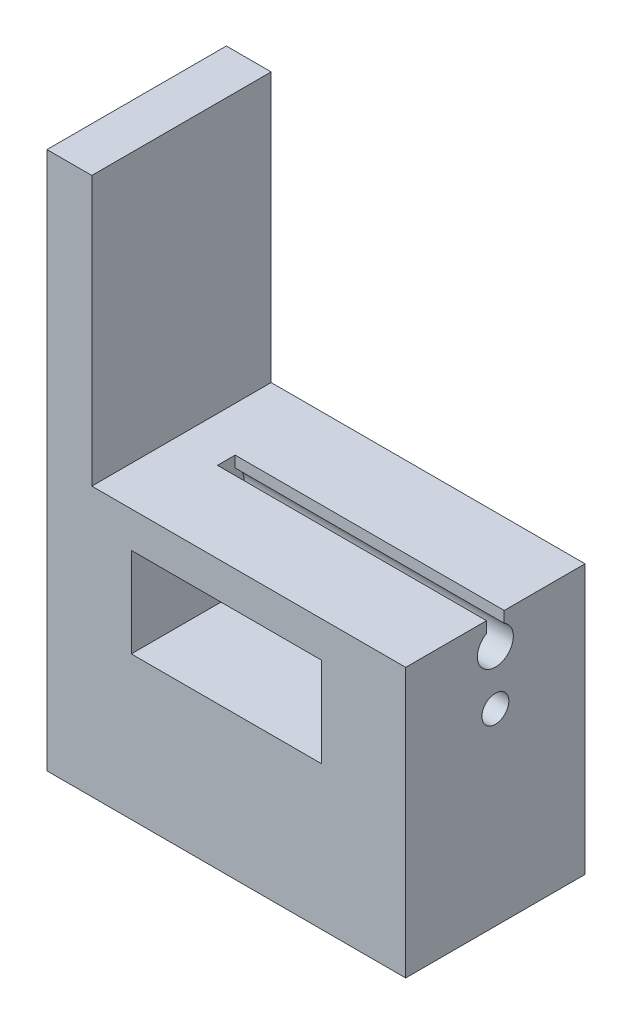
ISO-10303-21;
HEADER;
FILE_DESCRIPTION(('STEP AP214'),'2;1');
FILE_NAME('part.step','',(''),(''),'','','');
FILE_SCHEMA(('AUTOMOTIVE_DESIGN { 1 0 10303 214 1 1 1 1 }'));
ENDSEC;
DATA;
#1=APPLICATION_CONTEXT('core data for automotive mechanical design processes');
#2=APPLICATION_PROTOCOL_DEFINITION('international standard','automotive_design',2000,#1);
#3=PRODUCT_CONTEXT('',#1,'mechanical');
#4=PRODUCT('Part','Part','',(#3));
#5=PRODUCT_RELATED_PRODUCT_CATEGORY('part','',(#4));
#6=PRODUCT_DEFINITION_FORMATION('','',#4);
#7=PRODUCT_DEFINITION_CONTEXT('part definition',#1,'design');
#8=PRODUCT_DEFINITION('design','',#6,#7);
#9=PRODUCT_DEFINITION_SHAPE('','',#8);
#10=(LENGTH_UNIT() NAMED_UNIT(*) SI_UNIT(.MILLI.,.METRE.));
#11=(NAMED_UNIT(*) PLANE_ANGLE_UNIT() SI_UNIT($,.RADIAN.));
#12=(NAMED_UNIT(*) SI_UNIT($,.STERADIAN.) SOLID_ANGLE_UNIT());
#13=UNCERTAINTY_MEASURE_WITH_UNIT(LENGTH_MEASURE(1.E-05),#10,'distance_accuracy_value','');
#14=(GEOMETRIC_REPRESENTATION_CONTEXT(3) GLOBAL_UNCERTAINTY_ASSIGNED_CONTEXT((#13)) GLOBAL_UNIT_ASSIGNED_CONTEXT((#10,
#11,#12)) REPRESENTATION_CONTEXT('',''));
#15=CARTESIAN_POINT('',(0.,0.,0.));
#16=DIRECTION('',(0.,0.,1.));
#17=DIRECTION('',(1.,0.,0.));
#18=AXIS2_PLACEMENT_3D('',#15,#16,#17);
#19=CARTESIAN_POINT('',(25.4,38.1,-12.7));
#20=DIRECTION('',(-1.,0.,0.));
#21=DIRECTION('',(0.,0.,1.));
#22=AXIS2_PLACEMENT_3D('',#19,#20,#21);
#23=PLANE('',#22);
#24=CARTESIAN_POINT('',(25.4,26.67,0.));
#25=DIRECTION('',(-1.,0.,0.));
#26=DIRECTION('',(0.,0.,1.));
#27=AXIS2_PLACEMENT_3D('',#24,#25,#26);
#28=CIRCLE('',#27,1.905);
#29=CARTESIAN_POINT('',(25.4,26.67,1.905));
#30=VERTEX_POINT('',#29);
#31=EDGE_CURVE('E215',#30,#30,#28,.T.);
#32=ORIENTED_EDGE('',*,*,#31,.T.);
#33=EDGE_LOOP('',(#32));
#34=FACE_BOUND('',#33,.T.);
#35=CARTESIAN_POINT('',(25.4,34.3144735803698,0.));
#36=DIRECTION('',(1.,0.,0.));
#37=DIRECTION('',(0.,0.,-1.));
#38=AXIS2_PLACEMENT_3D('',#35,#36,#37);
#39=CIRCLE('',#38,2.54060551133991);
#40=CARTESIAN_POINT('',(25.4,36.5236841826004,1.25461742345731));
#41=VERTEX_POINT('',#40);
#42=CARTESIAN_POINT('',(25.4,36.5236841826004,-1.25461742345732));
#43=VERTEX_POINT('',#42);
#44=EDGE_CURVE('E180',#41,#43,#39,.T.);
#45=ORIENTED_EDGE('',*,*,#44,.F.);
#46=DIRECTION('',(0.,-1.,0.));
#47=VECTOR('',#46,1.);
#48=CARTESIAN_POINT('',(25.4,38.1,1.25461742345731));
#49=LINE('',#48,#47);
#50=CARTESIAN_POINT('',(25.4,38.1,1.25461742345731));
#51=VERTEX_POINT('',#50);
#52=EDGE_CURVE('E161',#51,#41,#49,.T.);
#53=ORIENTED_EDGE('',*,*,#52,.F.);
#54=DIRECTION('',(0.,0.,-1.));
#55=VECTOR('',#54,1.);
#56=CARTESIAN_POINT('',(25.4,38.1,-12.7));
#57=LINE('',#56,#55);
#58=CARTESIAN_POINT('',(25.4,38.1,12.7));
#59=VERTEX_POINT('',#58);
#60=EDGE_CURVE('E249',#59,#51,#57,.T.);
#61=ORIENTED_EDGE('',*,*,#60,.F.);
#62=DIRECTION('',(0.,-1.,0.));
#63=VECTOR('',#62,1.);
#64=CARTESIAN_POINT('',(25.4,38.1,12.7));
#65=LINE('',#64,#63);
#66=CARTESIAN_POINT('',(25.4,0.,12.7));
#67=VERTEX_POINT('',#66);
#68=EDGE_CURVE('E257',#59,#67,#65,.T.);
#69=ORIENTED_EDGE('',*,*,#68,.T.);
#70=DIRECTION('',(0.,0.,-1.));
#71=VECTOR('',#70,1.);
#72=CARTESIAN_POINT('',(25.4,0.,-12.7));
#73=LINE('',#72,#71);
#74=CARTESIAN_POINT('',(25.4,0.,-12.7));
#75=VERTEX_POINT('',#74);
#76=EDGE_CURVE('E240',#67,#75,#73,.T.);
#77=ORIENTED_EDGE('',*,*,#76,.T.);
#78=DIRECTION('',(0.,-1.,0.));
#79=VECTOR('',#78,1.);
#80=CARTESIAN_POINT('',(25.4,38.1,-12.7));
#81=LINE('',#80,#79);
#82=CARTESIAN_POINT('',(25.4,38.1,-12.7));
#83=VERTEX_POINT('',#82);
#84=EDGE_CURVE('E274',#83,#75,#81,.T.);
#85=ORIENTED_EDGE('',*,*,#84,.F.);
#86=CARTESIAN_POINT('',(25.4,38.1,-1.25461742345732));
#87=VERTEX_POINT('',#86);
#88=EDGE_CURVE('E253',#87,#83,#57,.T.);
#89=ORIENTED_EDGE('',*,*,#88,.F.);
#90=DIRECTION('',(0.,1.,0.));
#91=VECTOR('',#90,1.);
#92=CARTESIAN_POINT('',(25.4,38.1,-1.25461742345732));
#93=LINE('',#92,#91);
#94=EDGE_CURVE('E178',#43,#87,#93,.T.);
#95=ORIENTED_EDGE('',*,*,#94,.F.);
#96=EDGE_LOOP('',(#45,#53,#61,#69,#77,#85,#89,#95));
#97=FACE_BOUND('',#96,.T.);
#98=ADVANCED_FACE('F43',(#34,#97),#23,.F.);
#99=CARTESIAN_POINT('',(-25.4,38.1,-12.7));
#100=DIRECTION('',(0.,0.,1.));
#101=DIRECTION('',(1.,0.,0.));
#102=AXIS2_PLACEMENT_3D('',#99,#100,#101);
#103=PLANE('',#102);
#104=DIRECTION('',(-1.,0.,0.));
#105=VECTOR('',#104,1.);
#106=CARTESIAN_POINT('',(-13.4546315157849,33.02,-12.7));
#107=LINE('',#106,#105);
#108=CARTESIAN_POINT('',(13.4546315157849,33.02,-12.7));
#109=VERTEX_POINT('',#108);
#110=CARTESIAN_POINT('',(-13.4546315157849,33.02,-12.7));
#111=VERTEX_POINT('',#110);
#112=EDGE_CURVE('E233',#109,#111,#107,.T.);
#113=ORIENTED_EDGE('',*,*,#112,.T.);
#114=DIRECTION('',(0.,-1.,0.));
#115=VECTOR('',#114,1.);
#116=CARTESIAN_POINT('',(-13.4546315157849,33.02,-12.7));
#117=LINE('',#116,#115);
#118=CARTESIAN_POINT('',(-13.4546315157849,20.32,-12.7));
#119=VERTEX_POINT('',#118);
#120=EDGE_CURVE('E224',#111,#119,#117,.T.);
#121=ORIENTED_EDGE('',*,*,#120,.T.);
#122=DIRECTION('',(1.,0.,0.));
#123=VECTOR('',#122,1.);
#124=CARTESIAN_POINT('',(-13.4546315157849,20.32,-12.7));
#125=LINE('',#124,#123);
#126=CARTESIAN_POINT('',(13.4546315157849,20.32,-12.7));
#127=VERTEX_POINT('',#126);
#128=EDGE_CURVE('E227',#119,#127,#125,.T.);
#129=ORIENTED_EDGE('',*,*,#128,.T.);
#130=DIRECTION('',(0.,1.,0.));
#131=VECTOR('',#130,1.);
#132=CARTESIAN_POINT('',(13.4546315157849,33.02,-12.7));
#133=LINE('',#132,#131);
#134=EDGE_CURVE('E230',#127,#109,#133,.T.);
#135=ORIENTED_EDGE('',*,*,#134,.T.);
#136=EDGE_LOOP('',(#113,#121,#129,#135));
#137=FACE_BOUND('',#136,.T.);
#138=DIRECTION('',(-1.,0.,0.));
#139=VECTOR('',#138,1.);
#140=CARTESIAN_POINT('',(-25.4,0.,-12.7));
#141=LINE('',#140,#139);
#142=CARTESIAN_POINT('',(-25.4,0.,-12.7));
#143=VERTEX_POINT('',#142);
#144=EDGE_CURVE('E260',#75,#143,#141,.T.);
#145=ORIENTED_EDGE('',*,*,#144,.T.);
#146=DIRECTION('',(0.,-1.,0.));
#147=VECTOR('',#146,1.);
#148=CARTESIAN_POINT('',(-25.4,38.1,-12.7));
#149=LINE('',#148,#147);
#150=CARTESIAN_POINT('',(-25.4,76.2,-12.7));
#151=VERTEX_POINT('',#150);
#152=EDGE_CURVE('E271',#151,#143,#149,.T.);
#153=ORIENTED_EDGE('',*,*,#152,.F.);
#154=DIRECTION('',(-1.,0.,0.));
#155=VECTOR('',#154,1.);
#156=CARTESIAN_POINT('',(-25.4,76.2,-12.7));
#157=LINE('',#156,#155);
#158=CARTESIAN_POINT('',(-19.05,76.2,-12.7));
#159=VERTEX_POINT('',#158);
#160=EDGE_CURVE('E203',#159,#151,#157,.T.);
#161=ORIENTED_EDGE('',*,*,#160,.F.);
#162=DIRECTION('',(0.,-1.,0.));
#163=VECTOR('',#162,1.);
#164=CARTESIAN_POINT('',(-19.05,76.2,-12.7));
#165=LINE('',#164,#163);
#166=CARTESIAN_POINT('',(-19.05,38.1,-12.7));
#167=VERTEX_POINT('',#166);
#168=EDGE_CURVE('E206',#159,#167,#165,.T.);
#169=ORIENTED_EDGE('',*,*,#168,.T.);
#170=DIRECTION('',(-1.,0.,0.));
#171=VECTOR('',#170,1.);
#172=CARTESIAN_POINT('',(-25.4,38.1,-12.7));
#173=LINE('',#172,#171);
#174=EDGE_CURVE('E252',#83,#167,#173,.T.);
#175=ORIENTED_EDGE('',*,*,#174,.F.);
#176=ORIENTED_EDGE('',*,*,#84,.T.);
#177=EDGE_LOOP('',(#145,#153,#161,#169,#175,#176));
#178=FACE_BOUND('',#177,.T.);
#179=ADVANCED_FACE('F299',(#137,#178),#103,.F.);
#180=CARTESIAN_POINT('',(-25.4,38.1,-12.7));
#181=DIRECTION('',(1.,0.,0.));
#182=DIRECTION('',(0.,0.,-1.));
#183=AXIS2_PLACEMENT_3D('',#180,#181,#182);
#184=PLANE('',#183);
#185=CARTESIAN_POINT('',(-25.4,26.67,0.));
#186=DIRECTION('',(-1.,0.,0.));
#187=DIRECTION('',(0.,0.,1.));
#188=AXIS2_PLACEMENT_3D('',#185,#186,#187);
#189=CIRCLE('',#188,1.905);
#190=CARTESIAN_POINT('',(-25.4,26.67,1.905));
#191=VERTEX_POINT('',#190);
#192=EDGE_CURVE('E214',#191,#191,#189,.T.);
#193=ORIENTED_EDGE('',*,*,#192,.F.);
#194=EDGE_LOOP('',(#193));
#195=FACE_BOUND('',#194,.T.);
#196=DIRECTION('',(0.,0.,1.));
#197=VECTOR('',#196,1.);
#198=CARTESIAN_POINT('',(-25.4,0.,-12.7));
#199=LINE('',#198,#197);
#200=CARTESIAN_POINT('',(-25.4,0.,12.7));
#201=VERTEX_POINT('',#200);
#202=EDGE_CURVE('E262',#143,#201,#199,.T.);
#203=ORIENTED_EDGE('',*,*,#202,.T.);
#204=DIRECTION('',(0.,-1.,0.));
#205=VECTOR('',#204,1.);
#206=CARTESIAN_POINT('',(-25.4,38.1,12.7));
#207=LINE('',#206,#205);
#208=CARTESIAN_POINT('',(-25.4,76.2,12.7));
#209=VERTEX_POINT('',#208);
#210=EDGE_CURVE('E268',#209,#201,#207,.T.);
#211=ORIENTED_EDGE('',*,*,#210,.F.);
#212=DIRECTION('',(0.,0.,1.));
#213=VECTOR('',#212,1.);
#214=CARTESIAN_POINT('',(-25.4,76.2,12.7));
#215=LINE('',#214,#213);
#216=EDGE_CURVE('E196',#151,#209,#215,.T.);
#217=ORIENTED_EDGE('',*,*,#216,.F.);
#218=ORIENTED_EDGE('',*,*,#152,.T.);
#219=EDGE_LOOP('',(#203,#211,#217,#218));
#220=FACE_BOUND('',#219,.T.);
#221=ADVANCED_FACE('F330',(#195,#220),#184,.F.);
#222=CARTESIAN_POINT('',(-25.4,38.1,12.7));
#223=DIRECTION('',(0.,0.,-1.));
#224=DIRECTION('',(-1.,0.,0.));
#225=AXIS2_PLACEMENT_3D('',#222,#223,#224);
#226=PLANE('',#225);
#227=DIRECTION('',(-1.,0.,0.));
#228=VECTOR('',#227,1.);
#229=CARTESIAN_POINT('',(-25.4,20.32,12.7));
#230=LINE('',#229,#228);
#231=CARTESIAN_POINT('',(13.4546315157849,20.32,12.7));
#232=VERTEX_POINT('',#231);
#233=CARTESIAN_POINT('',(-13.4546315157849,20.32,12.7));
#234=VERTEX_POINT('',#233);
#235=EDGE_CURVE('E277',#232,#234,#230,.T.);
#236=ORIENTED_EDGE('',*,*,#235,.T.);
#237=DIRECTION('',(0.,1.,0.));
#238=VECTOR('',#237,1.);
#239=CARTESIAN_POINT('',(-13.4546315157849,38.1,12.7));
#240=LINE('',#239,#238);
#241=CARTESIAN_POINT('',(-13.4546315157849,33.02,12.7));
#242=VERTEX_POINT('',#241);
#243=EDGE_CURVE('E286',#234,#242,#240,.T.);
#244=ORIENTED_EDGE('',*,*,#243,.T.);
#245=DIRECTION('',(1.,0.,0.));
#246=VECTOR('',#245,1.);
#247=CARTESIAN_POINT('',(-25.4,33.02,12.7));
#248=LINE('',#247,#246);
#249=CARTESIAN_POINT('',(13.4546315157849,33.02,12.7));
#250=VERTEX_POINT('',#249);
#251=EDGE_CURVE('E283',#242,#250,#248,.T.);
#252=ORIENTED_EDGE('',*,*,#251,.T.);
#253=DIRECTION('',(0.,-1.,0.));
#254=VECTOR('',#253,1.);
#255=CARTESIAN_POINT('',(13.4546315157849,38.1,12.7));
#256=LINE('',#255,#254);
#257=EDGE_CURVE('E280',#250,#232,#256,.T.);
#258=ORIENTED_EDGE('',*,*,#257,.T.);
#259=EDGE_LOOP('',(#236,#244,#252,#258));
#260=FACE_BOUND('',#259,.T.);
#261=DIRECTION('',(1.,0.,0.));
#262=VECTOR('',#261,1.);
#263=CARTESIAN_POINT('',(-25.4,0.,12.7));
#264=LINE('',#263,#262);
#265=EDGE_CURVE('E264',#201,#67,#264,.T.);
#266=ORIENTED_EDGE('',*,*,#265,.T.);
#267=ORIENTED_EDGE('',*,*,#68,.F.);
#268=DIRECTION('',(1.,0.,0.));
#269=VECTOR('',#268,1.);
#270=CARTESIAN_POINT('',(-25.4,38.1,12.7));
#271=LINE('',#270,#269);
#272=CARTESIAN_POINT('',(-19.05,38.1,12.7));
#273=VERTEX_POINT('',#272);
#274=EDGE_CURVE('E255',#273,#59,#271,.T.);
#275=ORIENTED_EDGE('',*,*,#274,.F.);
#276=DIRECTION('',(0.,-1.,0.));
#277=VECTOR('',#276,1.);
#278=CARTESIAN_POINT('',(-19.05,76.2,12.7));
#279=LINE('',#278,#277);
#280=CARTESIAN_POINT('',(-19.05,76.2,12.7));
#281=VERTEX_POINT('',#280);
#282=EDGE_CURVE('E211',#281,#273,#279,.T.);
#283=ORIENTED_EDGE('',*,*,#282,.F.);
#284=DIRECTION('',(1.,0.,0.));
#285=VECTOR('',#284,1.);
#286=CARTESIAN_POINT('',(-25.4,76.2,12.7));
#287=LINE('',#286,#285);
#288=EDGE_CURVE('E199',#209,#281,#287,.T.);
#289=ORIENTED_EDGE('',*,*,#288,.F.);
#290=ORIENTED_EDGE('',*,*,#210,.T.);
#291=EDGE_LOOP('',(#266,#267,#275,#283,#289,#290));
#292=FACE_BOUND('',#291,.T.);
#293=ADVANCED_FACE('F307',(#260,#292),#226,.F.);
#294=CARTESIAN_POINT('',(0.,38.1,0.));
#295=DIRECTION('',(0.,1.,0.));
#296=DIRECTION('',(0.,0.,1.));
#297=AXIS2_PLACEMENT_3D('',#294,#295,#296);
#298=PLANE('',#297);
#299=DIRECTION('',(1.,0.,0.));
#300=VECTOR('',#299,1.);
#301=CARTESIAN_POINT('',(-12.7,38.1,1.25461742345732));
#302=LINE('',#301,#300);
#303=CARTESIAN_POINT('',(-12.7,38.1,1.25461742345732));
#304=VERTEX_POINT('',#303);
#305=EDGE_CURVE('E187',#304,#51,#302,.T.);
#306=ORIENTED_EDGE('',*,*,#305,.F.);
#307=DIRECTION('',(0.,0.,1.));
#308=VECTOR('',#307,1.);
#309=CARTESIAN_POINT('',(-12.7,38.1,1.25461742345732));
#310=LINE('',#309,#308);
#311=CARTESIAN_POINT('',(-12.7,38.1,-1.25461742345732));
#312=VERTEX_POINT('',#311);
#313=EDGE_CURVE('E165',#312,#304,#310,.T.);
#314=ORIENTED_EDGE('',*,*,#313,.F.);
#315=DIRECTION('',(1.,0.,0.));
#316=VECTOR('',#315,1.);
#317=CARTESIAN_POINT('',(-12.7,38.1,-1.25461742345732));
#318=LINE('',#317,#316);
#319=EDGE_CURVE('E189',#312,#87,#318,.T.);
#320=ORIENTED_EDGE('',*,*,#319,.T.);
#321=ORIENTED_EDGE('',*,*,#88,.T.);
#322=ORIENTED_EDGE('',*,*,#174,.T.);
#323=DIRECTION('',(0.,0.,-1.));
#324=VECTOR('',#323,1.);
#325=CARTESIAN_POINT('',(-19.05,38.1,12.7));
#326=LINE('',#325,#324);
#327=EDGE_CURVE('E195',#273,#167,#326,.T.);
#328=ORIENTED_EDGE('',*,*,#327,.F.);
#329=ORIENTED_EDGE('',*,*,#274,.T.);
#330=ORIENTED_EDGE('',*,*,#60,.T.);
#331=EDGE_LOOP('',(#306,#314,#320,#321,#322,#328,#329,#330));
#332=FACE_BOUND('',#331,.T.);
#333=ADVANCED_FACE('F320',(#332),#298,.T.);
#334=CARTESIAN_POINT('',(0.,0.,0.));
#335=DIRECTION('',(0.,1.,0.));
#336=DIRECTION('',(0.,0.,1.));
#337=AXIS2_PLACEMENT_3D('',#334,#335,#336);
#338=PLANE('',#337);
#339=ORIENTED_EDGE('',*,*,#76,.F.);
#340=ORIENTED_EDGE('',*,*,#265,.F.);
#341=ORIENTED_EDGE('',*,*,#202,.F.);
#342=ORIENTED_EDGE('',*,*,#144,.F.);
#343=EDGE_LOOP('',(#339,#340,#341,#342));
#344=FACE_BOUND('',#343,.T.);
#345=ADVANCED_FACE('F312',(#344),#338,.F.);
#346=CARTESIAN_POINT('',(-13.4546315157849,33.02,-12.7));
#347=DIRECTION('',(-1.,0.,0.));
#348=DIRECTION('',(0.,-1.,0.));
#349=AXIS2_PLACEMENT_3D('',#346,#347,#348);
#350=PLANE('',#349);
#351=CARTESIAN_POINT('',(-13.4546315157849,26.67,0.));
#352=DIRECTION('',(-1.,0.,0.));
#353=DIRECTION('',(0.,-1.,0.));
#354=AXIS2_PLACEMENT_3D('',#351,#352,#353);
#355=CIRCLE('',#354,1.905);
#356=CARTESIAN_POINT('',(-13.4546315157849,24.765,0.));
#357=VERTEX_POINT('',#356);
#358=EDGE_CURVE('E221',#357,#357,#355,.T.);
#359=ORIENTED_EDGE('',*,*,#358,.T.);
#360=EDGE_LOOP('',(#359));
#361=FACE_BOUND('',#360,.T.);
#362=DIRECTION('',(0.,0.,1.));
#363=VECTOR('',#362,1.);
#364=CARTESIAN_POINT('',(-13.4546315157849,20.32,-12.7));
#365=LINE('',#364,#363);
#366=EDGE_CURVE('E236',#119,#234,#365,.T.);
#367=ORIENTED_EDGE('',*,*,#366,.F.);
#368=ORIENTED_EDGE('',*,*,#120,.F.);
#369=DIRECTION('',(0.,0.,1.));
#370=VECTOR('',#369,1.);
#371=CARTESIAN_POINT('',(-13.4546315157849,33.02,-12.7));
#372=LINE('',#371,#370);
#373=EDGE_CURVE('E237',#111,#242,#372,.T.);
#374=ORIENTED_EDGE('',*,*,#373,.T.);
#375=ORIENTED_EDGE('',*,*,#243,.F.);
#376=EDGE_LOOP('',(#367,#368,#374,#375));
#377=FACE_BOUND('',#376,.T.);
#378=ADVANCED_FACE('F310',(#361,#377),#350,.F.);
#379=CARTESIAN_POINT('',(-13.4546315157849,33.02,-12.7));
#380=DIRECTION('',(0.,1.,0.));
#381=DIRECTION('',(0.,0.,1.));
#382=AXIS2_PLACEMENT_3D('',#379,#380,#381);
#383=PLANE('',#382);
#384=DIRECTION('',(0.,0.,-1.));
#385=VECTOR('',#384,1.);
#386=CARTESIAN_POINT('',(-12.7,33.02,-12.7));
#387=LINE('',#386,#385);
#388=CARTESIAN_POINT('',(-12.7,33.02,2.18609572388203));
#389=VERTEX_POINT('',#388);
#390=CARTESIAN_POINT('',(-12.7,33.02,-2.18609572388203));
#391=VERTEX_POINT('',#390);
#392=EDGE_CURVE('E11',#389,#391,#387,.T.);
#393=ORIENTED_EDGE('',*,*,#392,.F.);
#394=DIRECTION('',(1.,0.,0.));
#395=VECTOR('',#394,1.);
#396=CARTESIAN_POINT('',(-12.7,33.02,2.18609572388203));
#397=LINE('',#396,#395);
#398=CARTESIAN_POINT('',(13.4546315157849,33.02,2.18609572388202));
#399=VERTEX_POINT('',#398);
#400=EDGE_CURVE('E171',#389,#399,#397,.T.);
#401=ORIENTED_EDGE('',*,*,#400,.T.);
#402=DIRECTION('',(0.,0.,1.));
#403=VECTOR('',#402,1.);
#404=CARTESIAN_POINT('',(13.4546315157849,33.02,-12.7));
#405=LINE('',#404,#403);
#406=EDGE_CURVE('E244',#399,#250,#405,.T.);
#407=ORIENTED_EDGE('',*,*,#406,.T.);
#408=ORIENTED_EDGE('',*,*,#251,.F.);
#409=ORIENTED_EDGE('',*,*,#373,.F.);
#410=ORIENTED_EDGE('',*,*,#112,.F.);
#411=CARTESIAN_POINT('',(13.4546315157849,33.02,-2.18609572388203));
#412=VERTEX_POINT('',#411);
#413=EDGE_CURVE('E241',#109,#412,#405,.T.);
#414=ORIENTED_EDGE('',*,*,#413,.T.);
#415=DIRECTION('',(1.,0.,0.));
#416=VECTOR('',#415,1.);
#417=CARTESIAN_POINT('',(-12.7,33.02,-2.18609572388203));
#418=LINE('',#417,#416);
#419=EDGE_CURVE('E65',#412,#391,#418,.F.);
#420=ORIENTED_EDGE('',*,*,#419,.T.);
#421=EDGE_LOOP('',(#393,#401,#407,#408,#409,#410,#414,#420));
#422=FACE_BOUND('',#421,.T.);
#423=ADVANCED_FACE('F296',(#422),#383,.F.);
#424=CARTESIAN_POINT('',(13.4546315157849,33.02,-12.7));
#425=DIRECTION('',(1.,0.,0.));
#426=DIRECTION('',(0.,1.,0.));
#427=AXIS2_PLACEMENT_3D('',#424,#425,#426);
#428=PLANE('',#427);
#429=CARTESIAN_POINT('',(13.4546315157849,26.67,0.));
#430=DIRECTION('',(1.,0.,0.));
#431=DIRECTION('',(0.,1.,0.));
#432=AXIS2_PLACEMENT_3D('',#429,#430,#431);
#433=CIRCLE('',#432,1.905);
#434=CARTESIAN_POINT('',(13.4546315157849,28.575,0.));
#435=VERTEX_POINT('',#434);
#436=EDGE_CURVE('E218',#435,#435,#433,.T.);
#437=ORIENTED_EDGE('',*,*,#436,.T.);
#438=EDGE_LOOP('',(#437));
#439=FACE_BOUND('',#438,.T.);
#440=ORIENTED_EDGE('',*,*,#406,.F.);
#441=CARTESIAN_POINT('',(13.4546315157849,34.3144735803698,0.));
#442=DIRECTION('',(1.,0.,0.));
#443=DIRECTION('',(0.,1.,0.));
#444=AXIS2_PLACEMENT_3D('',#441,#442,#443);
#445=CIRCLE('',#444,2.54060551133991);
#446=EDGE_CURVE('E50',#399,#412,#445,.T.);
#447=ORIENTED_EDGE('',*,*,#446,.T.);
#448=ORIENTED_EDGE('',*,*,#413,.F.);
#449=ORIENTED_EDGE('',*,*,#134,.F.);
#450=DIRECTION('',(0.,0.,1.));
#451=VECTOR('',#450,1.);
#452=CARTESIAN_POINT('',(13.4546315157849,20.32,-12.7));
#453=LINE('',#452,#451);
#454=EDGE_CURVE('E245',#127,#232,#453,.T.);
#455=ORIENTED_EDGE('',*,*,#454,.T.);
#456=ORIENTED_EDGE('',*,*,#257,.F.);
#457=EDGE_LOOP('',(#440,#447,#448,#449,#455,#456));
#458=FACE_BOUND('',#457,.T.);
#459=ADVANCED_FACE('F292',(#439,#458),#428,.F.);
#460=CARTESIAN_POINT('',(-13.4546315157849,20.32,-12.7));
#461=DIRECTION('',(0.,-1.,0.));
#462=DIRECTION('',(0.,0.,-1.));
#463=AXIS2_PLACEMENT_3D('',#460,#461,#462);
#464=PLANE('',#463);
#465=ORIENTED_EDGE('',*,*,#454,.F.);
#466=ORIENTED_EDGE('',*,*,#128,.F.);
#467=ORIENTED_EDGE('',*,*,#366,.T.);
#468=ORIENTED_EDGE('',*,*,#235,.F.);
#469=EDGE_LOOP('',(#465,#466,#467,#468));
#470=FACE_BOUND('',#469,.T.);
#471=ADVANCED_FACE('F304',(#470),#464,.F.);
#472=CARTESIAN_POINT('',(25.4,26.67,0.));
#473=DIRECTION('',(-1.,0.,0.));
#474=DIRECTION('',(0.,0.,1.));
#475=AXIS2_PLACEMENT_3D('',#472,#473,#474);
#476=CYLINDRICAL_SURFACE('',#475,1.905);
#477=ORIENTED_EDGE('',*,*,#31,.F.);
#478=EDGE_LOOP('',(#477));
#479=FACE_BOUND('',#478,.T.);
#480=ORIENTED_EDGE('',*,*,#436,.F.);
#481=EDGE_LOOP('',(#480));
#482=FACE_BOUND('',#481,.T.);
#483=ADVANCED_FACE('F373',(#479,#482),#476,.F.);
#484=ORIENTED_EDGE('',*,*,#192,.T.);
#485=EDGE_LOOP('',(#484));
#486=FACE_BOUND('',#485,.T.);
#487=ORIENTED_EDGE('',*,*,#358,.F.);
#488=EDGE_LOOP('',(#487));
#489=FACE_BOUND('',#488,.T.);
#490=ADVANCED_FACE('F370',(#486,#489),#476,.F.);
#491=CARTESIAN_POINT('',(-19.05,76.2,12.7));
#492=DIRECTION('',(-1.,0.,0.));
#493=DIRECTION('',(0.,0.,1.));
#494=AXIS2_PLACEMENT_3D('',#491,#492,#493);
#495=PLANE('',#494);
#496=ORIENTED_EDGE('',*,*,#327,.T.);
#497=ORIENTED_EDGE('',*,*,#168,.F.);
#498=DIRECTION('',(0.,0.,-1.));
#499=VECTOR('',#498,1.);
#500=CARTESIAN_POINT('',(-19.05,76.2,12.7));
#501=LINE('',#500,#499);
#502=EDGE_CURVE('E201',#281,#159,#501,.T.);
#503=ORIENTED_EDGE('',*,*,#502,.F.);
#504=ORIENTED_EDGE('',*,*,#282,.T.);
#505=EDGE_LOOP('',(#496,#497,#503,#504));
#506=FACE_BOUND('',#505,.T.);
#507=ADVANCED_FACE('F349',(#506),#495,.F.);
#508=CARTESIAN_POINT('',(0.,76.2,0.));
#509=DIRECTION('',(0.,-1.,0.));
#510=DIRECTION('',(0.,0.,-1.));
#511=AXIS2_PLACEMENT_3D('',#508,#509,#510);
#512=PLANE('',#511);
#513=ORIENTED_EDGE('',*,*,#216,.T.);
#514=ORIENTED_EDGE('',*,*,#288,.T.);
#515=ORIENTED_EDGE('',*,*,#502,.T.);
#516=ORIENTED_EDGE('',*,*,#160,.T.);
#517=EDGE_LOOP('',(#513,#514,#515,#516));
#518=FACE_BOUND('',#517,.T.);
#519=ADVANCED_FACE('F355',(#518),#512,.F.);
#520=CARTESIAN_POINT('',(-12.7,34.3144735803698,0.));
#521=DIRECTION('',(1.,0.,0.));
#522=DIRECTION('',(0.,0.,-1.));
#523=AXIS2_PLACEMENT_3D('',#520,#521,#522);
#524=PLANE('',#523);
#525=ORIENTED_EDGE('',*,*,#392,.T.);
#526=CARTESIAN_POINT('',(-12.7,34.3144735803698,0.));
#527=DIRECTION('',(1.,0.,0.));
#528=DIRECTION('',(0.,0.,-1.));
#529=AXIS2_PLACEMENT_3D('',#526,#527,#528);
#530=CIRCLE('',#529,2.54060551133991);
#531=CARTESIAN_POINT('',(-12.7,36.5236841826004,-1.25461742345732));
#532=VERTEX_POINT('',#531);
#533=EDGE_CURVE('E173',#391,#532,#530,.T.);
#534=ORIENTED_EDGE('',*,*,#533,.T.);
#535=DIRECTION('',(0.,1.,0.));
#536=VECTOR('',#535,1.);
#537=CARTESIAN_POINT('',(-12.7,38.1,-1.25461742345732));
#538=LINE('',#537,#536);
#539=EDGE_CURVE('E57',#532,#312,#538,.T.);
#540=ORIENTED_EDGE('',*,*,#539,.T.);
#541=ORIENTED_EDGE('',*,*,#313,.T.);
#542=DIRECTION('',(0.,-1.,0.));
#543=VECTOR('',#542,1.);
#544=CARTESIAN_POINT('',(-12.7,38.1,1.25461742345732));
#545=LINE('',#544,#543);
#546=CARTESIAN_POINT('',(-12.7,36.5236841826004,1.25461742345732));
#547=VERTEX_POINT('',#546);
#548=EDGE_CURVE('E159',#304,#547,#545,.T.);
#549=ORIENTED_EDGE('',*,*,#548,.T.);
#550=EDGE_CURVE('E168',#547,#389,#530,.T.);
#551=ORIENTED_EDGE('',*,*,#550,.T.);
#552=EDGE_LOOP('',(#525,#534,#540,#541,#549,#551));
#553=FACE_BOUND('',#552,.T.);
#554=ADVANCED_FACE('F175',(#553),#524,.T.);
#555=CARTESIAN_POINT('',(-12.7,34.3144735803698,0.));
#556=DIRECTION('',(1.,0.,0.));
#557=DIRECTION('',(0.,0.,-1.));
#558=AXIS2_PLACEMENT_3D('',#555,#556,#557);
#559=CYLINDRICAL_SURFACE('',#558,2.54060551133991);
#560=ORIENTED_EDGE('',*,*,#550,.F.);
#561=DIRECTION('',(1.,0.,0.));
#562=VECTOR('',#561,1.);
#563=CARTESIAN_POINT('',(-12.7,36.5236841826004,1.25461742345732));
#564=LINE('',#563,#562);
#565=EDGE_CURVE('E155',#547,#41,#564,.T.);
#566=ORIENTED_EDGE('',*,*,#565,.T.);
#567=ORIENTED_EDGE('',*,*,#44,.T.);
#568=DIRECTION('',(1.,0.,0.));
#569=VECTOR('',#568,1.);
#570=CARTESIAN_POINT('',(-12.7,36.5236841826004,-1.25461742345732));
#571=LINE('',#570,#569);
#572=EDGE_CURVE('E164',#532,#43,#571,.T.);
#573=ORIENTED_EDGE('',*,*,#572,.F.);
#574=ORIENTED_EDGE('',*,*,#533,.F.);
#575=ORIENTED_EDGE('',*,*,#419,.F.);
#576=ORIENTED_EDGE('',*,*,#446,.F.);
#577=ORIENTED_EDGE('',*,*,#400,.F.);
#578=EDGE_LOOP('',(#560,#566,#567,#573,#574,#575,#576,#577));
#579=FACE_BOUND('',#578,.T.);
#580=ADVANCED_FACE('F169',(#579),#559,.F.);
#581=CARTESIAN_POINT('',(-12.7,38.1,1.25461742345732));
#582=DIRECTION('',(0.,0.,1.));
#583=DIRECTION('',(0.,-1.,0.));
#584=AXIS2_PLACEMENT_3D('',#581,#582,#583);
#585=PLANE('',#584);
#586=ORIENTED_EDGE('',*,*,#52,.T.);
#587=ORIENTED_EDGE('',*,*,#565,.F.);
#588=ORIENTED_EDGE('',*,*,#548,.F.);
#589=ORIENTED_EDGE('',*,*,#305,.T.);
#590=EDGE_LOOP('',(#586,#587,#588,#589));
#591=FACE_BOUND('',#590,.T.);
#592=ADVANCED_FACE('F157',(#591),#585,.F.);
#593=CARTESIAN_POINT('',(-12.7,38.1,-1.25461742345732));
#594=DIRECTION('',(0.,0.,-1.));
#595=DIRECTION('',(0.,1.,0.));
#596=AXIS2_PLACEMENT_3D('',#593,#594,#595);
#597=PLANE('',#596);
#598=ORIENTED_EDGE('',*,*,#94,.T.);
#599=ORIENTED_EDGE('',*,*,#319,.F.);
#600=ORIENTED_EDGE('',*,*,#539,.F.);
#601=ORIENTED_EDGE('',*,*,#572,.T.);
#602=EDGE_LOOP('',(#598,#599,#600,#601));
#603=FACE_BOUND('',#602,.T.);
#604=ADVANCED_FACE('F338',(#603),#597,.F.);
#605=CLOSED_SHELL('',(#98,#179,#221,#293,#333,#345,#378,#423,#459,#471,#483,#490,#507,#519,#554,
#580,#592,#604));
#606=MANIFOLD_SOLID_BREP('B2',#605);
#607=ADVANCED_BREP_SHAPE_REPRESENTATION('',(#18,#606),#14);
#608=SHAPE_DEFINITION_REPRESENTATION(#9,#607);
ENDSEC;
END-ISO-10303-21;
